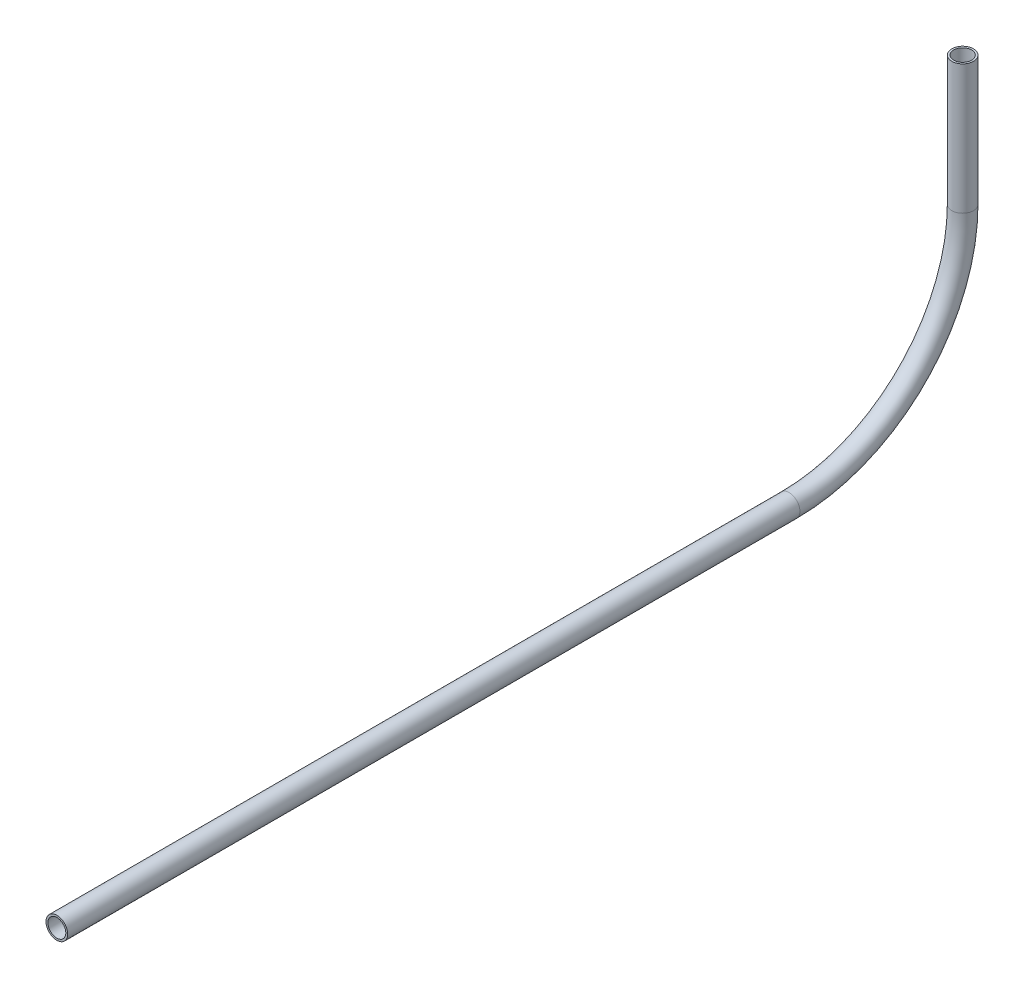
ISO-10303-21;
HEADER;
FILE_DESCRIPTION(('STEP AP214'),'2;1');
FILE_NAME('part.step','',(''),(''),'','','');
FILE_SCHEMA(('AUTOMOTIVE_DESIGN { 1 0 10303 214 1 1 1 1 }'));
ENDSEC;
DATA;
#1=APPLICATION_CONTEXT('core data for automotive mechanical design processes');
#2=APPLICATION_PROTOCOL_DEFINITION('international standard','automotive_design',2000,#1);
#3=PRODUCT_CONTEXT('',#1,'mechanical');
#4=PRODUCT('Part','Part','',(#3));
#5=PRODUCT_RELATED_PRODUCT_CATEGORY('part','',(#4));
#6=PRODUCT_DEFINITION_FORMATION('','',#4);
#7=PRODUCT_DEFINITION_CONTEXT('part definition',#1,'design');
#8=PRODUCT_DEFINITION('design','',#6,#7);
#9=PRODUCT_DEFINITION_SHAPE('','',#8);
#10=(LENGTH_UNIT() NAMED_UNIT(*) SI_UNIT(.MILLI.,.METRE.));
#11=(NAMED_UNIT(*) PLANE_ANGLE_UNIT() SI_UNIT($,.RADIAN.));
#12=(NAMED_UNIT(*) SI_UNIT($,.STERADIAN.) SOLID_ANGLE_UNIT());
#13=UNCERTAINTY_MEASURE_WITH_UNIT(LENGTH_MEASURE(1.E-05),#10,'distance_accuracy_value','');
#14=(GEOMETRIC_REPRESENTATION_CONTEXT(3) GLOBAL_UNCERTAINTY_ASSIGNED_CONTEXT((#13)) GLOBAL_UNIT_ASSIGNED_CONTEXT((#10,
#11,#12)) REPRESENTATION_CONTEXT('',''));
#15=CARTESIAN_POINT('',(0.,0.,0.));
#16=DIRECTION('',(0.,0.,1.));
#17=DIRECTION('',(1.,0.,0.));
#18=AXIS2_PLACEMENT_3D('',#15,#16,#17);
#19=CARTESIAN_POINT('',(0.,163.431959967836,57.1905566695228));
#20=DIRECTION('',(0.,0.,1.));
#21=DIRECTION('',(1.,0.,0.));
#22=AXIS2_PLACEMENT_3D('',#19,#20,#21);
#23=CYLINDRICAL_SURFACE('',#22,2.61619999999999);
#24=CARTESIAN_POINT('',(0.,163.431959967836,271.492619127408));
#25=DIRECTION('',(0.,0.,-1.));
#26=DIRECTION('',(-1.,0.,0.));
#27=AXIS2_PLACEMENT_3D('',#24,#25,#26);
#28=CIRCLE('',#27,2.61619999999999);
#29=CARTESIAN_POINT('',(-2.61619999999999,163.431959967836,271.492619127408));
#30=VERTEX_POINT('',#29);
#31=EDGE_CURVE('E55',#30,#30,#28,.T.);
#32=ORIENTED_EDGE('',*,*,#31,.F.);
#33=EDGE_LOOP('',(#32));
#34=FACE_BOUND('',#33,.T.);
#35=CARTESIAN_POINT('',(0.,163.431959967836,57.1905566695228));
#36=DIRECTION('',(0.,0.,-1.));
#37=DIRECTION('',(-1.,0.,0.));
#38=AXIS2_PLACEMENT_3D('',#35,#36,#37);
#39=CIRCLE('',#38,2.61619999999999);
#40=CARTESIAN_POINT('',(-2.61619999999999,163.431959967836,57.1905566695228));
#41=VERTEX_POINT('',#40);
#42=EDGE_CURVE('E51',#41,#41,#39,.T.);
#43=ORIENTED_EDGE('',*,*,#42,.T.);
#44=EDGE_LOOP('',(#43));
#45=FACE_BOUND('',#44,.T.);
#46=ADVANCED_FACE('F47',(#34,#45),#23,.F.);
#47=CARTESIAN_POINT('',(0.,163.431959967836,57.1905566695228));
#48=DIRECTION('',(0.,0.,1.));
#49=DIRECTION('',(1.,0.,0.));
#50=AXIS2_PLACEMENT_3D('',#47,#48,#49);
#51=CYLINDRICAL_SURFACE('',#50,3.175);
#52=CARTESIAN_POINT('',(0.,163.431959967836,271.492619127408));
#53=DIRECTION('',(0.,0.,-1.));
#54=DIRECTION('',(-1.,0.,0.));
#55=AXIS2_PLACEMENT_3D('',#52,#53,#54);
#56=CIRCLE('',#55,3.175);
#57=CARTESIAN_POINT('',(-3.175,163.431959967836,271.492619127408));
#58=VERTEX_POINT('',#57);
#59=EDGE_CURVE('E59',#58,#58,#56,.T.);
#60=ORIENTED_EDGE('',*,*,#59,.T.);
#61=EDGE_LOOP('',(#60));
#62=FACE_BOUND('',#61,.T.);
#63=CARTESIAN_POINT('',(0.,163.431959967836,57.1905566695228));
#64=DIRECTION('',(0.,0.,-1.));
#65=DIRECTION('',(-1.,0.,0.));
#66=AXIS2_PLACEMENT_3D('',#63,#64,#65);
#67=CIRCLE('',#66,3.175);
#68=CARTESIAN_POINT('',(-3.175,163.431959967836,57.1905566695228));
#69=VERTEX_POINT('',#68);
#70=EDGE_CURVE('E12',#69,#69,#67,.T.);
#71=ORIENTED_EDGE('',*,*,#70,.F.);
#72=EDGE_LOOP('',(#71));
#73=FACE_BOUND('',#72,.T.);
#74=ADVANCED_FACE('F74',(#62,#73),#51,.T.);
#75=CARTESIAN_POINT('',(0.,163.431959967836,271.492619127408));
#76=DIRECTION('',(0.,0.,-1.));
#77=DIRECTION('',(-1.,0.,0.));
#78=AXIS2_PLACEMENT_3D('',#75,#76,#77);
#79=PLANE('',#78);
#80=ORIENTED_EDGE('',*,*,#31,.T.);
#81=EDGE_LOOP('',(#80));
#82=FACE_BOUND('',#81,.T.);
#83=ORIENTED_EDGE('',*,*,#59,.F.);
#84=EDGE_LOOP('',(#83));
#85=FACE_BOUND('',#84,.T.);
#86=ADVANCED_FACE('F70',(#82,#85),#79,.F.);
#87=CARTESIAN_POINT('',(0.,163.431959967836,57.1905566695228));
#88=DIRECTION('',(0.,0.,-1.));
#89=DIRECTION('',(-1.,0.,0.));
#90=AXIS2_PLACEMENT_3D('',#87,#88,#89);
#91=PLANE('',#90);
#92=ORIENTED_EDGE('',*,*,#42,.F.);
#93=EDGE_LOOP('',(#92));
#94=FACE_BOUND('',#93,.T.);
#95=ORIENTED_EDGE('',*,*,#70,.T.);
#96=EDGE_LOOP('',(#95));
#97=FACE_BOUND('',#96,.T.);
#98=ADVANCED_FACE('F49',(#94,#97),#91,.T.);
#99=CLOSED_SHELL('',(#46,#74,#86,#98));
#100=MANIFOLD_SOLID_BREP('B2',#99);
#101=CARTESIAN_POINT('',(0.,214.231959967836,57.1905566695228));
#102=DIRECTION('',(-1.,0.,0.));
#103=DIRECTION('',(0.,0.,1.));
#104=AXIS2_PLACEMENT_3D('',#101,#102,#103);
#105=TOROIDAL_SURFACE('',#104,50.8,2.61619999999999);
#106=CARTESIAN_POINT('',(0.,214.231959967836,6.39055666952282));
#107=DIRECTION('',(0.,1.,0.));
#108=DIRECTION('',(0.,0.,1.));
#109=AXIS2_PLACEMENT_3D('',#106,#107,#108);
#110=CIRCLE('',#109,2.61619999999999);
#111=CARTESIAN_POINT('',(0.,214.231959967836,3.77435666952283));
#112=VERTEX_POINT('',#111);
#113=EDGE_CURVE('E150',#112,#112,#110,.T.);
#114=CARTESIAN_POINT('',(0.,163.431959967836,57.1905566695228));
#115=DIRECTION('',(0.,0.,1.));
#116=DIRECTION('',(1.,0.,0.));
#117=AXIS2_PLACEMENT_3D('',#114,#115,#116);
#118=CIRCLE('',#117,2.61619999999999);
#119=CARTESIAN_POINT('',(0.,160.815759967836,57.1905566695228));
#120=VERTEX_POINT('',#119);
#121=EDGE_CURVE('E140',#120,#120,#118,.T.);
#122=CARTESIAN_POINT('',(0.,214.231959967836,57.1905566695228));
#123=DIRECTION('',(-1.,0.,0.));
#124=DIRECTION('',(0.,0.,1.));
#125=AXIS2_PLACEMENT_3D('',#122,#123,#124);
#126=CIRCLE('',#125,53.4162);
#127=EDGE_CURVE('',#112,#120,#126,.T.);
#128=ORIENTED_EDGE('',*,*,#113,.T.);
#129=ORIENTED_EDGE('',*,*,#121,.T.);
#130=ORIENTED_EDGE('',*,*,#127,.T.);
#131=ORIENTED_EDGE('',*,*,#127,.F.);
#132=EDGE_LOOP('',(#128,#130,#129,#131));
#133=FACE_BOUND('',#132,.T.);
#134=ADVANCED_FACE('F136',(#133),#105,.F.);
#135=CARTESIAN_POINT('',(0.,214.231959967836,57.1905566695228));
#136=DIRECTION('',(-1.,0.,0.));
#137=DIRECTION('',(0.,0.,1.));
#138=AXIS2_PLACEMENT_3D('',#135,#136,#137);
#139=TOROIDAL_SURFACE('',#138,50.8,3.175);
#140=CARTESIAN_POINT('',(0.,214.231959967836,6.39055666952282));
#141=DIRECTION('',(0.,1.,0.));
#142=DIRECTION('',(0.,0.,1.));
#143=AXIS2_PLACEMENT_3D('',#140,#141,#142);
#144=CIRCLE('',#143,3.175);
#145=CARTESIAN_POINT('',(0.,214.231959967836,3.21555666952282));
#146=VERTEX_POINT('',#145);
#147=EDGE_CURVE('E144',#146,#146,#144,.T.);
#148=CARTESIAN_POINT('',(0.,163.431959967836,57.1905566695228));
#149=DIRECTION('',(0.,0.,1.));
#150=DIRECTION('',(1.,0.,0.));
#151=AXIS2_PLACEMENT_3D('',#148,#149,#150);
#152=CIRCLE('',#151,3.175);
#153=CARTESIAN_POINT('',(0.,160.256959967836,57.1905566695228));
#154=VERTEX_POINT('',#153);
#155=EDGE_CURVE('E46',#154,#154,#152,.T.);
#156=CARTESIAN_POINT('',(0.,214.231959967836,57.1905566695228));
#157=DIRECTION('',(-1.,0.,0.));
#158=DIRECTION('',(0.,0.,1.));
#159=AXIS2_PLACEMENT_3D('',#156,#157,#158);
#160=CIRCLE('',#159,53.975);
#161=EDGE_CURVE('',#146,#154,#160,.T.);
#162=ORIENTED_EDGE('',*,*,#147,.F.);
#163=ORIENTED_EDGE('',*,*,#155,.F.);
#164=ORIENTED_EDGE('',*,*,#161,.T.);
#165=ORIENTED_EDGE('',*,*,#161,.F.);
#166=EDGE_LOOP('',(#162,#164,#163,#165));
#167=FACE_BOUND('',#166,.T.);
#168=ADVANCED_FACE('F163',(#167),#139,.T.);
#169=CARTESIAN_POINT('',(0.,214.231959967836,6.39055666952284));
#170=DIRECTION('',(0.,1.,0.));
#171=DIRECTION('',(0.,0.,1.));
#172=AXIS2_PLACEMENT_3D('',#169,#170,#171);
#173=PLANE('',#172);
#174=ORIENTED_EDGE('',*,*,#113,.F.);
#175=EDGE_LOOP('',(#174));
#176=FACE_BOUND('',#175,.T.);
#177=ORIENTED_EDGE('',*,*,#147,.T.);
#178=EDGE_LOOP('',(#177));
#179=FACE_BOUND('',#178,.T.);
#180=ADVANCED_FACE('F159',(#176,#179),#173,.T.);
#181=CARTESIAN_POINT('',(0.,163.431959967836,57.1905566695228));
#182=DIRECTION('',(0.,0.,1.));
#183=DIRECTION('',(1.,0.,0.));
#184=AXIS2_PLACEMENT_3D('',#181,#182,#183);
#185=PLANE('',#184);
#186=ORIENTED_EDGE('',*,*,#121,.F.);
#187=EDGE_LOOP('',(#186));
#188=FACE_BOUND('',#187,.T.);
#189=ORIENTED_EDGE('',*,*,#155,.T.);
#190=EDGE_LOOP('',(#189));
#191=FACE_BOUND('',#190,.T.);
#192=ADVANCED_FACE('F138',(#188,#191),#185,.T.);
#193=CLOSED_SHELL('',(#134,#168,#180,#192));
#194=MANIFOLD_SOLID_BREP('B7',#193);
#195=CARTESIAN_POINT('',(0.,252.086964851694,6.39055666952287));
#196=DIRECTION('',(0.,-1.,0.));
#197=DIRECTION('',(0.,0.,-1.));
#198=AXIS2_PLACEMENT_3D('',#195,#196,#197);
#199=CYLINDRICAL_SURFACE('',#198,2.61619999999999);
#200=CARTESIAN_POINT('',(0.,252.086964851694,6.39055666952287));
#201=DIRECTION('',(0.,1.,0.));
#202=DIRECTION('',(-1.,0.,0.));
#203=AXIS2_PLACEMENT_3D('',#200,#201,#202);
#204=CIRCLE('',#203,2.61619999999999);
#205=CARTESIAN_POINT('',(-2.61619999999999,252.086964851694,6.39055666952287));
#206=VERTEX_POINT('',#205);
#207=EDGE_CURVE('E234',#206,#206,#204,.T.);
#208=ORIENTED_EDGE('',*,*,#207,.T.);
#209=EDGE_LOOP('',(#208));
#210=FACE_BOUND('',#209,.T.);
#211=CARTESIAN_POINT('',(0.,214.231959967836,6.39055666952287));
#212=DIRECTION('',(0.,-1.,0.));
#213=DIRECTION('',(0.,0.,-1.));
#214=AXIS2_PLACEMENT_3D('',#211,#212,#213);
#215=CIRCLE('',#214,2.61619999999999);
#216=CARTESIAN_POINT('',(0.,214.231959967836,3.77435666952288));
#217=VERTEX_POINT('',#216);
#218=EDGE_CURVE('E224',#217,#217,#215,.T.);
#219=ORIENTED_EDGE('',*,*,#218,.T.);
#220=EDGE_LOOP('',(#219));
#221=FACE_BOUND('',#220,.T.);
#222=ADVANCED_FACE('F220',(#210,#221),#199,.F.);
#223=CARTESIAN_POINT('',(0.,252.086964851694,6.39055666952287));
#224=DIRECTION('',(0.,-1.,0.));
#225=DIRECTION('',(0.,0.,-1.));
#226=AXIS2_PLACEMENT_3D('',#223,#224,#225);
#227=CYLINDRICAL_SURFACE('',#226,3.175);
#228=CARTESIAN_POINT('',(0.,252.086964851694,6.39055666952287));
#229=DIRECTION('',(0.,1.,0.));
#230=DIRECTION('',(-1.,0.,0.));
#231=AXIS2_PLACEMENT_3D('',#228,#229,#230);
#232=CIRCLE('',#231,3.175);
#233=CARTESIAN_POINT('',(-3.175,252.086964851694,6.39055666952287));
#234=VERTEX_POINT('',#233);
#235=EDGE_CURVE('E228',#234,#234,#232,.T.);
#236=ORIENTED_EDGE('',*,*,#235,.F.);
#237=EDGE_LOOP('',(#236));
#238=FACE_BOUND('',#237,.T.);
#239=CARTESIAN_POINT('',(0.,214.231959967836,6.39055666952287));
#240=DIRECTION('',(0.,-1.,0.));
#241=DIRECTION('',(0.,0.,-1.));
#242=AXIS2_PLACEMENT_3D('',#239,#240,#241);
#243=CIRCLE('',#242,3.175);
#244=CARTESIAN_POINT('',(0.,214.231959967836,3.21555666952288));
#245=VERTEX_POINT('',#244);
#246=EDGE_CURVE('E135',#245,#245,#243,.T.);
#247=ORIENTED_EDGE('',*,*,#246,.F.);
#248=EDGE_LOOP('',(#247));
#249=FACE_BOUND('',#248,.T.);
#250=ADVANCED_FACE('F247',(#238,#249),#227,.T.);
#251=CARTESIAN_POINT('',(0.,252.086964851694,6.39055666952287));
#252=DIRECTION('',(0.,1.,0.));
#253=DIRECTION('',(-1.,0.,0.));
#254=AXIS2_PLACEMENT_3D('',#251,#252,#253);
#255=PLANE('',#254);
#256=ORIENTED_EDGE('',*,*,#207,.F.);
#257=EDGE_LOOP('',(#256));
#258=FACE_BOUND('',#257,.T.);
#259=ORIENTED_EDGE('',*,*,#235,.T.);
#260=EDGE_LOOP('',(#259));
#261=FACE_BOUND('',#260,.T.);
#262=ADVANCED_FACE('F243',(#258,#261),#255,.T.);
#263=CARTESIAN_POINT('',(0.,214.231959967836,6.39055666952284));
#264=DIRECTION('',(0.,-1.,0.));
#265=DIRECTION('',(0.,0.,-1.));
#266=AXIS2_PLACEMENT_3D('',#263,#264,#265);
#267=PLANE('',#266);
#268=ORIENTED_EDGE('',*,*,#218,.F.);
#269=EDGE_LOOP('',(#268));
#270=FACE_BOUND('',#269,.T.);
#271=ORIENTED_EDGE('',*,*,#246,.T.);
#272=EDGE_LOOP('',(#271));
#273=FACE_BOUND('',#272,.T.);
#274=ADVANCED_FACE('F222',(#270,#273),#267,.T.);
#275=CLOSED_SHELL('',(#222,#250,#262,#274));
#276=MANIFOLD_SOLID_BREP('B41',#275);
#277=ADVANCED_BREP_SHAPE_REPRESENTATION('',(#18,#100,#194,#276),#14);
#278=SHAPE_DEFINITION_REPRESENTATION(#9,#277);
ENDSEC;
END-ISO-10303-21;
